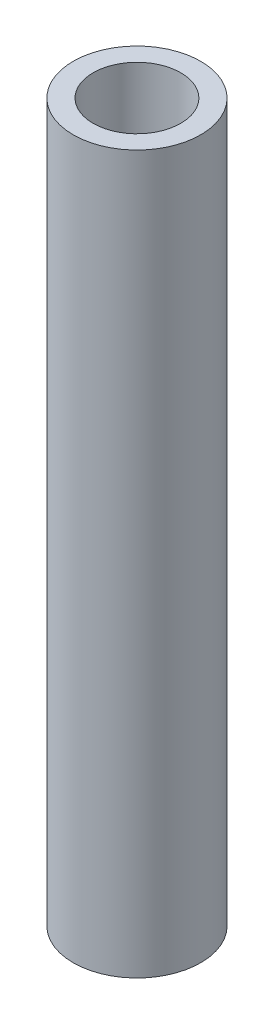
ISO-10303-21;
HEADER;
FILE_DESCRIPTION(('STEP AP214'),'2;1');
FILE_NAME('part.step','',(''),(''),'','','');
FILE_SCHEMA(('AUTOMOTIVE_DESIGN { 1 0 10303 214 1 1 1 1 }'));
ENDSEC;
DATA;
#1=APPLICATION_CONTEXT('core data for automotive mechanical design processes');
#2=APPLICATION_PROTOCOL_DEFINITION('international standard','automotive_design',2000,#1);
#3=PRODUCT_CONTEXT('',#1,'mechanical');
#4=PRODUCT('Part','Part','',(#3));
#5=PRODUCT_RELATED_PRODUCT_CATEGORY('part','',(#4));
#6=PRODUCT_DEFINITION_FORMATION('','',#4);
#7=PRODUCT_DEFINITION_CONTEXT('part definition',#1,'design');
#8=PRODUCT_DEFINITION('design','',#6,#7);
#9=PRODUCT_DEFINITION_SHAPE('','',#8);
#10=(LENGTH_UNIT() NAMED_UNIT(*) SI_UNIT(.MILLI.,.METRE.));
#11=(NAMED_UNIT(*) PLANE_ANGLE_UNIT() SI_UNIT($,.RADIAN.));
#12=(NAMED_UNIT(*) SI_UNIT($,.STERADIAN.) SOLID_ANGLE_UNIT());
#13=UNCERTAINTY_MEASURE_WITH_UNIT(LENGTH_MEASURE(1.E-05),#10,'distance_accuracy_value','');
#14=(GEOMETRIC_REPRESENTATION_CONTEXT(3) GLOBAL_UNCERTAINTY_ASSIGNED_CONTEXT((#13)) GLOBAL_UNIT_ASSIGNED_CONTEXT((#10,
#11,#12)) REPRESENTATION_CONTEXT('',''));
#15=CARTESIAN_POINT('',(0.,0.,0.));
#16=DIRECTION('',(0.,0.,1.));
#17=DIRECTION('',(1.,0.,0.));
#18=AXIS2_PLACEMENT_3D('',#15,#16,#17);
#19=CARTESIAN_POINT('',(0.,450.,0.));
#20=DIRECTION('',(0.,1.,0.));
#21=DIRECTION('',(0.,0.,1.));
#22=AXIS2_PLACEMENT_3D('',#19,#20,#21);
#23=PLANE('',#22);
#24=CARTESIAN_POINT('',(0.,450.,0.));
#25=DIRECTION('',(0.,1.,0.));
#26=DIRECTION('',(0.,0.,1.));
#27=AXIS2_PLACEMENT_3D('',#24,#25,#26);
#28=CIRCLE('',#27,40.);
#29=CARTESIAN_POINT('',(0.,450.,40.));
#30=VERTEX_POINT('',#29);
#31=EDGE_CURVE('E10',#30,#30,#28,.T.);
#32=ORIENTED_EDGE('',*,*,#31,.T.);
#33=EDGE_LOOP('',(#32));
#34=FACE_BOUND('',#33,.T.);
#35=CARTESIAN_POINT('',(0.,450.,0.));
#36=DIRECTION('',(0.,1.,0.));
#37=DIRECTION('',(0.,0.,1.));
#38=AXIS2_PLACEMENT_3D('',#35,#36,#37);
#39=CIRCLE('',#38,27.5);
#40=CARTESIAN_POINT('',(0.,450.,27.5));
#41=VERTEX_POINT('',#40);
#42=EDGE_CURVE('E46',#41,#41,#39,.T.);
#43=ORIENTED_EDGE('',*,*,#42,.F.);
#44=EDGE_LOOP('',(#43));
#45=FACE_BOUND('',#44,.T.);
#46=ADVANCED_FACE('F35',(#34,#45),#23,.T.);
#47=CARTESIAN_POINT('',(0.,0.,0.));
#48=DIRECTION('',(0.,1.,0.));
#49=DIRECTION('',(0.,0.,1.));
#50=AXIS2_PLACEMENT_3D('',#47,#48,#49);
#51=PLANE('',#50);
#52=CARTESIAN_POINT('',(0.,0.,0.));
#53=DIRECTION('',(0.,1.,0.));
#54=DIRECTION('',(0.,0.,1.));
#55=AXIS2_PLACEMENT_3D('',#52,#53,#54);
#56=CIRCLE('',#55,40.);
#57=CARTESIAN_POINT('',(0.,0.,40.));
#58=VERTEX_POINT('',#57);
#59=EDGE_CURVE('E39',#58,#58,#56,.T.);
#60=ORIENTED_EDGE('',*,*,#59,.F.);
#61=EDGE_LOOP('',(#60));
#62=FACE_BOUND('',#61,.T.);
#63=CARTESIAN_POINT('',(0.,0.,0.));
#64=DIRECTION('',(0.,1.,0.));
#65=DIRECTION('',(0.,0.,1.));
#66=AXIS2_PLACEMENT_3D('',#63,#64,#65);
#67=CIRCLE('',#66,27.5);
#68=CARTESIAN_POINT('',(0.,0.,27.5));
#69=VERTEX_POINT('',#68);
#70=EDGE_CURVE('E48',#69,#69,#67,.T.);
#71=ORIENTED_EDGE('',*,*,#70,.T.);
#72=EDGE_LOOP('',(#71));
#73=FACE_BOUND('',#72,.T.);
#74=ADVANCED_FACE('F58',(#62,#73),#51,.F.);
#75=CARTESIAN_POINT('',(0.,450.,0.));
#76=DIRECTION('',(0.,-1.,0.));
#77=DIRECTION('',(0.,0.,-1.));
#78=AXIS2_PLACEMENT_3D('',#75,#76,#77);
#79=CYLINDRICAL_SURFACE('',#78,40.);
#80=ORIENTED_EDGE('',*,*,#31,.F.);
#81=EDGE_LOOP('',(#80));
#82=FACE_BOUND('',#81,.T.);
#83=ORIENTED_EDGE('',*,*,#59,.T.);
#84=EDGE_LOOP('',(#83));
#85=FACE_BOUND('',#84,.T.);
#86=ADVANCED_FACE('F37',(#82,#85),#79,.T.);
#87=CARTESIAN_POINT('',(0.,450.,0.));
#88=DIRECTION('',(0.,-1.,0.));
#89=DIRECTION('',(0.,0.,-1.));
#90=AXIS2_PLACEMENT_3D('',#87,#88,#89);
#91=CYLINDRICAL_SURFACE('',#90,27.5);
#92=ORIENTED_EDGE('',*,*,#42,.T.);
#93=EDGE_LOOP('',(#92));
#94=FACE_BOUND('',#93,.T.);
#95=ORIENTED_EDGE('',*,*,#70,.F.);
#96=EDGE_LOOP('',(#95));
#97=FACE_BOUND('',#96,.T.);
#98=ADVANCED_FACE('F54',(#94,#97),#91,.F.);
#99=CLOSED_SHELL('',(#46,#74,#86,#98));
#100=MANIFOLD_SOLID_BREP('B2',#99);
#101=ADVANCED_BREP_SHAPE_REPRESENTATION('',(#18,#100),#14);
#102=SHAPE_DEFINITION_REPRESENTATION(#9,#101);
ENDSEC;
END-ISO-10303-21;
